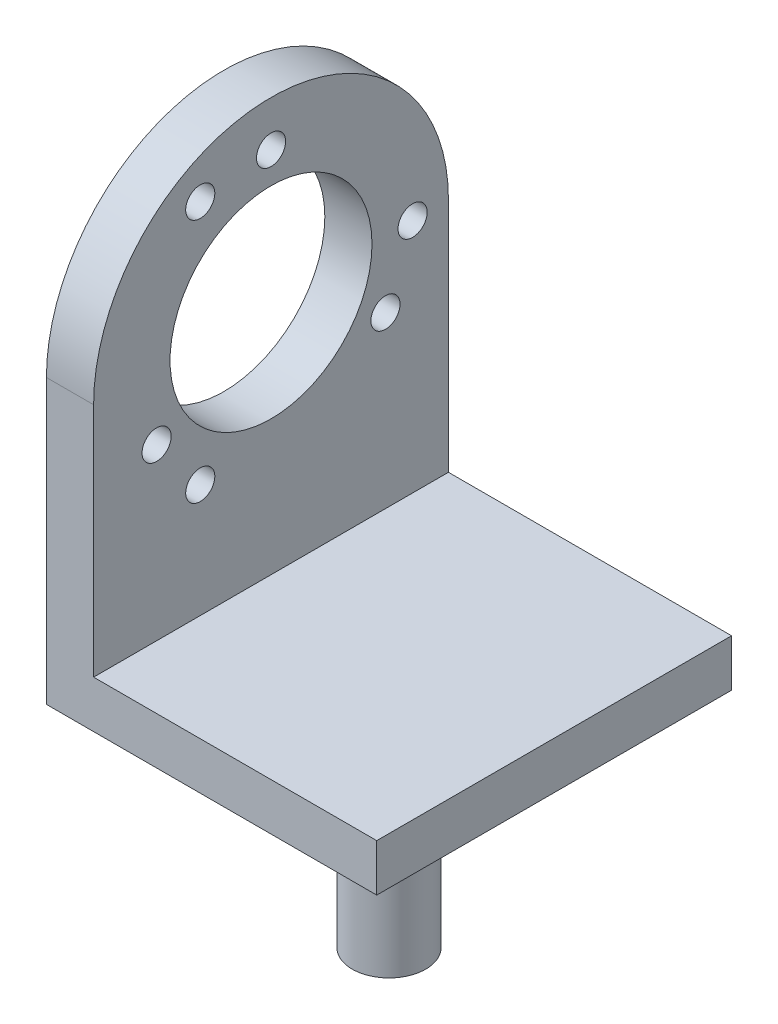
ISO-10303-21;
HEADER;
FILE_DESCRIPTION(('STEP AP214'),'2;1');
FILE_NAME('part.step','',(''),(''),'','','');
FILE_SCHEMA(('AUTOMOTIVE_DESIGN { 1 0 10303 214 1 1 1 1 }'));
ENDSEC;
DATA;
#1=APPLICATION_CONTEXT('core data for automotive mechanical design processes');
#2=APPLICATION_PROTOCOL_DEFINITION('international standard','automotive_design',2000,#1);
#3=PRODUCT_CONTEXT('',#1,'mechanical');
#4=PRODUCT('Part','Part','',(#3));
#5=PRODUCT_RELATED_PRODUCT_CATEGORY('part','',(#4));
#6=PRODUCT_DEFINITION_FORMATION('','',#4);
#7=PRODUCT_DEFINITION_CONTEXT('part definition',#1,'design');
#8=PRODUCT_DEFINITION('design','',#6,#7);
#9=PRODUCT_DEFINITION_SHAPE('','',#8);
#10=(LENGTH_UNIT() NAMED_UNIT(*) SI_UNIT(.MILLI.,.METRE.));
#11=(NAMED_UNIT(*) PLANE_ANGLE_UNIT() SI_UNIT($,.RADIAN.));
#12=(NAMED_UNIT(*) SI_UNIT($,.STERADIAN.) SOLID_ANGLE_UNIT());
#13=UNCERTAINTY_MEASURE_WITH_UNIT(LENGTH_MEASURE(1.E-05),#10,'distance_accuracy_value','');
#14=(GEOMETRIC_REPRESENTATION_CONTEXT(3) GLOBAL_UNCERTAINTY_ASSIGNED_CONTEXT((#13)) GLOBAL_UNIT_ASSIGNED_CONTEXT((#10,
#11,#12)) REPRESENTATION_CONTEXT('',''));
#15=CARTESIAN_POINT('',(0.,0.,0.));
#16=DIRECTION('',(0.,0.,1.));
#17=DIRECTION('',(1.,0.,0.));
#18=AXIS2_PLACEMENT_3D('',#15,#16,#17);
#19=CARTESIAN_POINT('',(-17.5,0.,0.));
#20=DIRECTION('',(0.,-1.,0.));
#21=DIRECTION('',(1.,0.,0.));
#22=AXIS2_PLACEMENT_3D('',#19,#20,#21);
#23=CYLINDRICAL_SURFACE('',#22,9.);
#24=CARTESIAN_POINT('',(-17.5,-8.,0.));
#25=DIRECTION('',(0.,-1.,0.));
#26=DIRECTION('',(1.,0.,0.));
#27=AXIS2_PLACEMENT_3D('',#24,#25,#26);
#28=CIRCLE('',#27,9.);
#29=CARTESIAN_POINT('',(-26.5,-8.,0.));
#30=VERTEX_POINT('',#29);
#31=EDGE_CURVE('E255',#30,#30,#28,.T.);
#32=ORIENTED_EDGE('',*,*,#31,.F.);
#33=DIRECTION('',(0.,1.,0.));
#34=VECTOR('',#33,1.);
#35=CARTESIAN_POINT('',(-26.5,0.,0.));
#36=LINE('',#35,#34);
#37=CARTESIAN_POINT('',(-26.5,0.,0.));
#38=VERTEX_POINT('',#37);
#39=EDGE_CURVE('E10',#30,#38,#36,.T.);
#40=ORIENTED_EDGE('',*,*,#39,.T.);
#41=CARTESIAN_POINT('',(-17.5,0.,0.));
#42=DIRECTION('',(0.,1.,0.));
#43=DIRECTION('',(1.,0.,0.));
#44=AXIS2_PLACEMENT_3D('',#41,#42,#43);
#45=CIRCLE('',#44,9.);
#46=EDGE_CURVE('E267',#38,#38,#45,.T.);
#47=ORIENTED_EDGE('',*,*,#46,.F.);
#48=ORIENTED_EDGE('',*,*,#39,.F.);
#49=EDGE_LOOP('',(#32,#40,#47,#48));
#50=FACE_BOUND('',#49,.T.);
#51=ADVANCED_FACE('F16',(#50),#23,.T.);
#52=CARTESIAN_POINT('',(-35.,23.,12.1243556529822));
#53=DIRECTION('',(1.,0.,0.));
#54=DIRECTION('',(0.,0.,1.));
#55=AXIS2_PLACEMENT_3D('',#52,#53,#54);
#56=CYLINDRICAL_SURFACE('',#55,1.543);
#57=CARTESIAN_POINT('',(-35.,23.,12.1243556529822));
#58=DIRECTION('',(1.,0.,0.));
#59=DIRECTION('',(0.,0.,1.));
#60=AXIS2_PLACEMENT_3D('',#57,#58,#59);
#61=CIRCLE('',#60,1.543);
#62=CARTESIAN_POINT('',(-35.,23.,10.5813556529822));
#63=VERTEX_POINT('',#62);
#64=EDGE_CURVE('E218',#63,#63,#61,.T.);
#65=ORIENTED_EDGE('',*,*,#64,.F.);
#66=DIRECTION('',(1.,0.,0.));
#67=VECTOR('',#66,1.);
#68=CARTESIAN_POINT('',(-35.,23.,10.5813556529822));
#69=LINE('',#68,#67);
#70=CARTESIAN_POINT('',(-30.,23.,10.5813556529822));
#71=VERTEX_POINT('',#70);
#72=EDGE_CURVE('E27',#63,#71,#69,.T.);
#73=ORIENTED_EDGE('',*,*,#72,.T.);
#74=CARTESIAN_POINT('',(-30.,23.,12.1243556529822));
#75=DIRECTION('',(-1.,0.,0.));
#76=DIRECTION('',(0.,0.,1.));
#77=AXIS2_PLACEMENT_3D('',#74,#75,#76);
#78=CIRCLE('',#77,1.543);
#79=EDGE_CURVE('E200',#71,#71,#78,.T.);
#80=ORIENTED_EDGE('',*,*,#79,.F.);
#81=ORIENTED_EDGE('',*,*,#72,.F.);
#82=EDGE_LOOP('',(#65,#73,#80,#81));
#83=FACE_BOUND('',#82,.T.);
#84=ADVANCED_FACE('F512',(#83),#56,.F.);
#85=CARTESIAN_POINT('',(-35.,44.,0.));
#86=DIRECTION('',(1.,0.,0.));
#87=DIRECTION('',(0.,0.,1.));
#88=AXIS2_PLACEMENT_3D('',#85,#86,#87);
#89=CYLINDRICAL_SURFACE('',#88,1.543);
#90=CARTESIAN_POINT('',(-35.,44.,0.));
#91=DIRECTION('',(1.,0.,0.));
#92=DIRECTION('',(0.,0.,1.));
#93=AXIS2_PLACEMENT_3D('',#90,#91,#92);
#94=CIRCLE('',#93,1.543);
#95=CARTESIAN_POINT('',(-35.,44.,-1.543));
#96=VERTEX_POINT('',#95);
#97=EDGE_CURVE('E234',#96,#96,#94,.T.);
#98=ORIENTED_EDGE('',*,*,#97,.F.);
#99=DIRECTION('',(1.,0.,0.));
#100=VECTOR('',#99,1.);
#101=CARTESIAN_POINT('',(-35.,44.,-1.543));
#102=LINE('',#101,#100);
#103=CARTESIAN_POINT('',(-30.,44.,-1.543));
#104=VERTEX_POINT('',#103);
#105=EDGE_CURVE('E228',#96,#104,#102,.T.);
#106=ORIENTED_EDGE('',*,*,#105,.T.);
#107=CARTESIAN_POINT('',(-30.,44.,0.));
#108=DIRECTION('',(-1.,0.,0.));
#109=DIRECTION('',(0.,0.,1.));
#110=AXIS2_PLACEMENT_3D('',#107,#108,#109);
#111=CIRCLE('',#110,1.543);
#112=EDGE_CURVE('E204',#104,#104,#111,.T.);
#113=ORIENTED_EDGE('',*,*,#112,.F.);
#114=ORIENTED_EDGE('',*,*,#105,.F.);
#115=EDGE_LOOP('',(#98,#106,#113,#114));
#116=FACE_BOUND('',#115,.T.);
#117=ADVANCED_FACE('F497',(#116),#89,.F.);
#118=CARTESIAN_POINT('',(-35.,23.,-12.1243556529822));
#119=DIRECTION('',(1.,0.,0.));
#120=DIRECTION('',(0.,0.,1.));
#121=AXIS2_PLACEMENT_3D('',#118,#119,#120);
#122=CYLINDRICAL_SURFACE('',#121,1.543);
#123=CARTESIAN_POINT('',(-35.,23.,-12.1243556529822));
#124=DIRECTION('',(1.,0.,0.));
#125=DIRECTION('',(0.,0.,1.));
#126=AXIS2_PLACEMENT_3D('',#123,#124,#125);
#127=CIRCLE('',#126,1.543);
#128=CARTESIAN_POINT('',(-35.,23.,-13.6673556529822));
#129=VERTEX_POINT('',#128);
#130=EDGE_CURVE('E262',#129,#129,#127,.T.);
#131=ORIENTED_EDGE('',*,*,#130,.F.);
#132=DIRECTION('',(1.,0.,0.));
#133=VECTOR('',#132,1.);
#134=CARTESIAN_POINT('',(-35.,23.,-13.6673556529822));
#135=LINE('',#134,#133);
#136=CARTESIAN_POINT('',(-30.,23.,-13.6673556529822));
#137=VERTEX_POINT('',#136);
#138=EDGE_CURVE('E84',#129,#137,#135,.T.);
#139=ORIENTED_EDGE('',*,*,#138,.T.);
#140=CARTESIAN_POINT('',(-30.,23.,-12.1243556529822));
#141=DIRECTION('',(-1.,0.,0.));
#142=DIRECTION('',(0.,0.,1.));
#143=AXIS2_PLACEMENT_3D('',#140,#141,#142);
#144=CIRCLE('',#143,1.543);
#145=EDGE_CURVE('E186',#137,#137,#144,.T.);
#146=ORIENTED_EDGE('',*,*,#145,.F.);
#147=ORIENTED_EDGE('',*,*,#138,.F.);
#148=EDGE_LOOP('',(#131,#139,#146,#147));
#149=FACE_BOUND('',#148,.T.);
#150=ADVANCED_FACE('F520',(#149),#122,.F.);
#151=CARTESIAN_POINT('',(-35.,30.,-15.));
#152=DIRECTION('',(1.,0.,0.));
#153=DIRECTION('',(0.,0.,1.));
#154=AXIS2_PLACEMENT_3D('',#151,#152,#153);
#155=CYLINDRICAL_SURFACE('',#154,1.543);
#156=CARTESIAN_POINT('',(-35.,30.,-15.));
#157=DIRECTION('',(1.,0.,0.));
#158=DIRECTION('',(0.,0.,1.));
#159=AXIS2_PLACEMENT_3D('',#156,#157,#158);
#160=CIRCLE('',#159,1.543);
#161=CARTESIAN_POINT('',(-35.,30.,-16.543));
#162=VERTEX_POINT('',#161);
#163=EDGE_CURVE('E259',#162,#162,#160,.T.);
#164=ORIENTED_EDGE('',*,*,#163,.F.);
#165=DIRECTION('',(1.,0.,0.));
#166=VECTOR('',#165,1.);
#167=CARTESIAN_POINT('',(-35.,30.,-16.543));
#168=LINE('',#167,#166);
#169=CARTESIAN_POINT('',(-30.,30.,-16.543));
#170=VERTEX_POINT('',#169);
#171=EDGE_CURVE('E97',#162,#170,#168,.T.);
#172=ORIENTED_EDGE('',*,*,#171,.T.);
#173=CARTESIAN_POINT('',(-30.,30.,-15.));
#174=DIRECTION('',(-1.,0.,0.));
#175=DIRECTION('',(0.,0.,1.));
#176=AXIS2_PLACEMENT_3D('',#173,#174,#175);
#177=CIRCLE('',#176,1.543);
#178=EDGE_CURVE('E177',#170,#170,#177,.T.);
#179=ORIENTED_EDGE('',*,*,#178,.F.);
#180=ORIENTED_EDGE('',*,*,#171,.F.);
#181=EDGE_LOOP('',(#164,#172,#179,#180));
#182=FACE_BOUND('',#181,.T.);
#183=ADVANCED_FACE('F504',(#182),#155,.F.);
#184=CARTESIAN_POINT('',(-35.,42.9903810567667,7.5));
#185=DIRECTION('',(1.,0.,0.));
#186=DIRECTION('',(0.,0.,1.));
#187=AXIS2_PLACEMENT_3D('',#184,#185,#186);
#188=CYLINDRICAL_SURFACE('',#187,1.543);
#189=CARTESIAN_POINT('',(-35.,42.9903810567667,7.5));
#190=DIRECTION('',(1.,0.,0.));
#191=DIRECTION('',(0.,0.,1.));
#192=AXIS2_PLACEMENT_3D('',#189,#190,#191);
#193=CIRCLE('',#192,1.543);
#194=CARTESIAN_POINT('',(-35.,42.9903810567667,5.957));
#195=VERTEX_POINT('',#194);
#196=EDGE_CURVE('E169',#195,#195,#193,.T.);
#197=ORIENTED_EDGE('',*,*,#196,.F.);
#198=DIRECTION('',(1.,0.,0.));
#199=VECTOR('',#198,1.);
#200=CARTESIAN_POINT('',(-35.,42.9903810567667,5.957));
#201=LINE('',#200,#199);
#202=CARTESIAN_POINT('',(-30.,42.9903810567667,5.957));
#203=VERTEX_POINT('',#202);
#204=EDGE_CURVE('E164',#195,#203,#201,.T.);
#205=ORIENTED_EDGE('',*,*,#204,.T.);
#206=CARTESIAN_POINT('',(-30.,42.9903810567667,7.5));
#207=DIRECTION('',(-1.,0.,0.));
#208=DIRECTION('',(0.,0.,1.));
#209=AXIS2_PLACEMENT_3D('',#206,#207,#208);
#210=CIRCLE('',#209,1.543);
#211=EDGE_CURVE('E167',#203,#203,#210,.T.);
#212=ORIENTED_EDGE('',*,*,#211,.F.);
#213=ORIENTED_EDGE('',*,*,#204,.F.);
#214=EDGE_LOOP('',(#197,#205,#212,#213));
#215=FACE_BOUND('',#214,.T.);
#216=ADVANCED_FACE('F166',(#215),#188,.F.);
#217=CARTESIAN_POINT('',(-35.,17.0096189432333,7.5));
#218=DIRECTION('',(1.,0.,0.));
#219=DIRECTION('',(0.,0.,1.));
#220=AXIS2_PLACEMENT_3D('',#217,#218,#219);
#221=CYLINDRICAL_SURFACE('',#220,1.543);
#222=CARTESIAN_POINT('',(-35.,17.0096189432333,7.5));
#223=DIRECTION('',(1.,0.,0.));
#224=DIRECTION('',(0.,0.,1.));
#225=AXIS2_PLACEMENT_3D('',#222,#223,#224);
#226=CIRCLE('',#225,1.543);
#227=CARTESIAN_POINT('',(-35.,17.0096189432333,5.957));
#228=VERTEX_POINT('',#227);
#229=EDGE_CURVE('E213',#228,#228,#226,.T.);
#230=ORIENTED_EDGE('',*,*,#229,.F.);
#231=DIRECTION('',(1.,0.,0.));
#232=VECTOR('',#231,1.);
#233=CARTESIAN_POINT('',(-35.,17.0096189432333,5.957));
#234=LINE('',#233,#232);
#235=CARTESIAN_POINT('',(-30.,17.0096189432333,5.957));
#236=VERTEX_POINT('',#235);
#237=EDGE_CURVE('E171',#228,#236,#234,.T.);
#238=ORIENTED_EDGE('',*,*,#237,.T.);
#239=CARTESIAN_POINT('',(-30.,17.0096189432333,7.5));
#240=DIRECTION('',(-1.,0.,0.));
#241=DIRECTION('',(0.,0.,1.));
#242=AXIS2_PLACEMENT_3D('',#239,#240,#241);
#243=CIRCLE('',#242,1.543);
#244=EDGE_CURVE('E178',#236,#236,#243,.T.);
#245=ORIENTED_EDGE('',*,*,#244,.F.);
#246=ORIENTED_EDGE('',*,*,#237,.F.);
#247=EDGE_LOOP('',(#230,#238,#245,#246));
#248=FACE_BOUND('',#247,.T.);
#249=ADVANCED_FACE('F525',(#248),#221,.F.);
#250=CARTESIAN_POINT('',(-35.,30.,0.));
#251=DIRECTION('',(1.,0.,0.));
#252=DIRECTION('',(0.,0.,1.));
#253=AXIS2_PLACEMENT_3D('',#250,#251,#252);
#254=CYLINDRICAL_SURFACE('',#253,10.7);
#255=CARTESIAN_POINT('',(-35.,30.,0.));
#256=DIRECTION('',(1.,0.,0.));
#257=DIRECTION('',(0.,0.,1.));
#258=AXIS2_PLACEMENT_3D('',#255,#256,#257);
#259=CIRCLE('',#258,10.7);
#260=CARTESIAN_POINT('',(-35.,30.,-10.7));
#261=VERTEX_POINT('',#260);
#262=EDGE_CURVE('E209',#261,#261,#259,.T.);
#263=ORIENTED_EDGE('',*,*,#262,.F.);
#264=DIRECTION('',(1.,0.,0.));
#265=VECTOR('',#264,1.);
#266=CARTESIAN_POINT('',(-35.,30.,-10.7));
#267=LINE('',#266,#265);
#268=CARTESIAN_POINT('',(-30.,30.,-10.7));
#269=VERTEX_POINT('',#268);
#270=EDGE_CURVE('E225',#261,#269,#267,.T.);
#271=ORIENTED_EDGE('',*,*,#270,.T.);
#272=CARTESIAN_POINT('',(-30.,30.,0.));
#273=DIRECTION('',(-1.,0.,0.));
#274=DIRECTION('',(0.,0.,1.));
#275=AXIS2_PLACEMENT_3D('',#272,#273,#274);
#276=CIRCLE('',#275,10.7);
#277=EDGE_CURVE('E189',#269,#269,#276,.T.);
#278=ORIENTED_EDGE('',*,*,#277,.F.);
#279=ORIENTED_EDGE('',*,*,#270,.F.);
#280=EDGE_LOOP('',(#263,#271,#278,#279));
#281=FACE_BOUND('',#280,.T.);
#282=ADVANCED_FACE('F528',(#281),#254,.F.);
#283=CARTESIAN_POINT('',(-17.5,24.4,18.8));
#284=DIRECTION('',(0.,0.,1.));
#285=DIRECTION('',(1.,0.,0.));
#286=AXIS2_PLACEMENT_3D('',#283,#284,#285);
#287=PLANE('',#286);
#288=DIRECTION('',(-1.,0.,0.));
#289=VECTOR('',#288,1.);
#290=CARTESIAN_POINT('',(-35.,30.,18.8));
#291=LINE('',#290,#289);
#292=CARTESIAN_POINT('',(-30.,30.,18.8));
#293=VERTEX_POINT('',#292);
#294=CARTESIAN_POINT('',(-35.,30.,18.8));
#295=VERTEX_POINT('',#294);
#296=EDGE_CURVE('E244',#293,#295,#291,.T.);
#297=ORIENTED_EDGE('',*,*,#296,.T.);
#298=DIRECTION('',(0.,-1.,0.));
#299=VECTOR('',#298,1.);
#300=CARTESIAN_POINT('',(-35.,48.8,18.8));
#301=LINE('',#300,#299);
#302=CARTESIAN_POINT('',(-35.,0.,18.8));
#303=VERTEX_POINT('',#302);
#304=EDGE_CURVE('E214',#295,#303,#301,.T.);
#305=ORIENTED_EDGE('',*,*,#304,.T.);
#306=DIRECTION('',(1.,0.,0.));
#307=VECTOR('',#306,1.);
#308=CARTESIAN_POINT('',(-35.,0.,18.8));
#309=LINE('',#308,#307);
#310=CARTESIAN_POINT('',(0.,0.,18.8));
#311=VERTEX_POINT('',#310);
#312=EDGE_CURVE('E263',#303,#311,#309,.T.);
#313=ORIENTED_EDGE('',*,*,#312,.T.);
#314=DIRECTION('',(0.,1.,0.));
#315=VECTOR('',#314,1.);
#316=CARTESIAN_POINT('',(0.,0.,18.8));
#317=LINE('',#316,#315);
#318=CARTESIAN_POINT('',(0.,5.,18.8));
#319=VERTEX_POINT('',#318);
#320=EDGE_CURVE('E279',#311,#319,#317,.T.);
#321=ORIENTED_EDGE('',*,*,#320,.T.);
#322=DIRECTION('',(-1.,0.,0.));
#323=VECTOR('',#322,1.);
#324=CARTESIAN_POINT('',(0.,5.,18.8));
#325=LINE('',#324,#323);
#326=CARTESIAN_POINT('',(-30.,5.,18.8));
#327=VERTEX_POINT('',#326);
#328=EDGE_CURVE('E203',#319,#327,#325,.T.);
#329=ORIENTED_EDGE('',*,*,#328,.T.);
#330=DIRECTION('',(0.,1.,0.));
#331=VECTOR('',#330,1.);
#332=CARTESIAN_POINT('',(-30.,5.,18.8));
#333=LINE('',#332,#331);
#334=EDGE_CURVE('E20',#327,#293,#333,.T.);
#335=ORIENTED_EDGE('',*,*,#334,.T.);
#336=EDGE_LOOP('',(#297,#305,#313,#321,#329,#335));
#337=FACE_BOUND('',#336,.T.);
#338=ADVANCED_FACE('F338',(#337),#287,.T.);
#339=CARTESIAN_POINT('',(0.,5.,0.));
#340=DIRECTION('',(0.,1.,0.));
#341=DIRECTION('',(1.,0.,0.));
#342=AXIS2_PLACEMENT_3D('',#339,#340,#341);
#343=PLANE('',#342);
#344=DIRECTION('',(0.,0.,1.));
#345=VECTOR('',#344,1.);
#346=CARTESIAN_POINT('',(-30.,5.,0.));
#347=LINE('',#346,#345);
#348=CARTESIAN_POINT('',(-30.,5.,-18.8));
#349=VERTEX_POINT('',#348);
#350=EDGE_CURVE('E272',#349,#327,#347,.T.);
#351=ORIENTED_EDGE('',*,*,#350,.T.);
#352=ORIENTED_EDGE('',*,*,#328,.F.);
#353=DIRECTION('',(0.,0.,-1.));
#354=VECTOR('',#353,1.);
#355=CARTESIAN_POINT('',(0.,5.,0.));
#356=LINE('',#355,#354);
#357=CARTESIAN_POINT('',(0.,5.,-18.8));
#358=VERTEX_POINT('',#357);
#359=EDGE_CURVE('E276',#319,#358,#356,.T.);
#360=ORIENTED_EDGE('',*,*,#359,.T.);
#361=DIRECTION('',(1.,0.,0.));
#362=VECTOR('',#361,1.);
#363=CARTESIAN_POINT('',(0.,5.,-18.8));
#364=LINE('',#363,#362);
#365=EDGE_CURVE('E195',#349,#358,#364,.T.);
#366=ORIENTED_EDGE('',*,*,#365,.F.);
#367=EDGE_LOOP('',(#351,#352,#360,#366));
#368=FACE_BOUND('',#367,.T.);
#369=ADVANCED_FACE('F359',(#368),#343,.T.);
#370=CARTESIAN_POINT('',(-30.,5.,0.));
#371=DIRECTION('',(1.,0.,0.));
#372=DIRECTION('',(0.,1.,0.));
#373=AXIS2_PLACEMENT_3D('',#370,#371,#372);
#374=PLANE('',#373);
#375=ORIENTED_EDGE('',*,*,#79,.T.);
#376=EDGE_LOOP('',(#375));
#377=FACE_BOUND('',#376,.T.);
#378=ORIENTED_EDGE('',*,*,#112,.T.);
#379=EDGE_LOOP('',(#378));
#380=FACE_BOUND('',#379,.T.);
#381=ORIENTED_EDGE('',*,*,#145,.T.);
#382=EDGE_LOOP('',(#381));
#383=FACE_BOUND('',#382,.T.);
#384=ORIENTED_EDGE('',*,*,#178,.T.);
#385=EDGE_LOOP('',(#384));
#386=FACE_BOUND('',#385,.T.);
#387=ORIENTED_EDGE('',*,*,#211,.T.);
#388=EDGE_LOOP('',(#387));
#389=FACE_BOUND('',#388,.T.);
#390=ORIENTED_EDGE('',*,*,#244,.T.);
#391=EDGE_LOOP('',(#390));
#392=FACE_BOUND('',#391,.T.);
#393=ORIENTED_EDGE('',*,*,#277,.T.);
#394=EDGE_LOOP('',(#393));
#395=FACE_BOUND('',#394,.T.);
#396=CARTESIAN_POINT('',(-30.,30.,0.));
#397=DIRECTION('',(1.,0.,0.));
#398=DIRECTION('',(0.,0.,-1.));
#399=AXIS2_PLACEMENT_3D('',#396,#397,#398);
#400=CIRCLE('',#399,18.8);
#401=CARTESIAN_POINT('',(-30.,30.,-18.8));
#402=VERTEX_POINT('',#401);
#403=EDGE_CURVE('E250',#402,#293,#400,.T.);
#404=ORIENTED_EDGE('',*,*,#403,.T.);
#405=ORIENTED_EDGE('',*,*,#334,.F.);
#406=ORIENTED_EDGE('',*,*,#350,.F.);
#407=DIRECTION('',(0.,-1.,0.));
#408=VECTOR('',#407,1.);
#409=CARTESIAN_POINT('',(-30.,5.,-18.8));
#410=LINE('',#409,#408);
#411=EDGE_CURVE('E193',#402,#349,#410,.T.);
#412=ORIENTED_EDGE('',*,*,#411,.F.);
#413=EDGE_LOOP('',(#404,#405,#406,#412));
#414=FACE_BOUND('',#413,.T.);
#415=ADVANCED_FACE('F174',(#377,#380,#383,#386,#389,#392,#395,#414),#374,.T.);
#416=CARTESIAN_POINT('',(-35.,0.,0.));
#417=DIRECTION('',(0.,-1.,0.));
#418=DIRECTION('',(0.,0.,-1.));
#419=AXIS2_PLACEMENT_3D('',#416,#417,#418);
#420=PLANE('',#419);
#421=ORIENTED_EDGE('',*,*,#46,.T.);
#422=EDGE_LOOP('',(#421));
#423=FACE_BOUND('',#422,.T.);
#424=DIRECTION('',(0.,0.,1.));
#425=VECTOR('',#424,1.);
#426=CARTESIAN_POINT('',(0.,0.,0.));
#427=LINE('',#426,#425);
#428=CARTESIAN_POINT('',(0.,0.,-18.8));
#429=VERTEX_POINT('',#428);
#430=EDGE_CURVE('E268',#429,#311,#427,.T.);
#431=ORIENTED_EDGE('',*,*,#430,.T.);
#432=ORIENTED_EDGE('',*,*,#312,.F.);
#433=DIRECTION('',(0.,0.,1.));
#434=VECTOR('',#433,1.);
#435=CARTESIAN_POINT('',(-35.,0.,0.));
#436=LINE('',#435,#434);
#437=CARTESIAN_POINT('',(-35.,0.,-18.8));
#438=VERTEX_POINT('',#437);
#439=EDGE_CURVE('E219',#438,#303,#436,.T.);
#440=ORIENTED_EDGE('',*,*,#439,.F.);
#441=DIRECTION('',(-1.,0.,0.));
#442=VECTOR('',#441,1.);
#443=CARTESIAN_POINT('',(-35.,0.,-18.8));
#444=LINE('',#443,#442);
#445=EDGE_CURVE('E208',#429,#438,#444,.T.);
#446=ORIENTED_EDGE('',*,*,#445,.F.);
#447=EDGE_LOOP('',(#431,#432,#440,#446));
#448=FACE_BOUND('',#447,.T.);
#449=ADVANCED_FACE('F337',(#423,#448),#420,.T.);
#450=CARTESIAN_POINT('',(0.,0.,0.));
#451=DIRECTION('',(1.,0.,0.));
#452=DIRECTION('',(0.,1.,0.));
#453=AXIS2_PLACEMENT_3D('',#450,#451,#452);
#454=PLANE('',#453);
#455=ORIENTED_EDGE('',*,*,#359,.F.);
#456=ORIENTED_EDGE('',*,*,#320,.F.);
#457=ORIENTED_EDGE('',*,*,#430,.F.);
#458=DIRECTION('',(0.,-1.,0.));
#459=VECTOR('',#458,1.);
#460=CARTESIAN_POINT('',(0.,0.,-18.8));
#461=LINE('',#460,#459);
#462=EDGE_CURVE('E199',#358,#429,#461,.T.);
#463=ORIENTED_EDGE('',*,*,#462,.F.);
#464=EDGE_LOOP('',(#455,#456,#457,#463));
#465=FACE_BOUND('',#464,.T.);
#466=ADVANCED_FACE('F354',(#465),#454,.T.);
#467=CARTESIAN_POINT('',(-17.5,24.4,-18.8));
#468=DIRECTION('',(0.,0.,-1.));
#469=DIRECTION('',(0.,-1.,0.));
#470=AXIS2_PLACEMENT_3D('',#467,#468,#469);
#471=PLANE('',#470);
#472=DIRECTION('',(-1.,0.,0.));
#473=VECTOR('',#472,1.);
#474=CARTESIAN_POINT('',(-35.,30.,-18.8));
#475=LINE('',#474,#473);
#476=CARTESIAN_POINT('',(-35.,30.,-18.8));
#477=VERTEX_POINT('',#476);
#478=EDGE_CURVE('E254',#402,#477,#475,.T.);
#479=ORIENTED_EDGE('',*,*,#478,.F.);
#480=ORIENTED_EDGE('',*,*,#411,.T.);
#481=ORIENTED_EDGE('',*,*,#365,.T.);
#482=ORIENTED_EDGE('',*,*,#462,.T.);
#483=ORIENTED_EDGE('',*,*,#445,.T.);
#484=DIRECTION('',(0.,1.,0.));
#485=VECTOR('',#484,1.);
#486=CARTESIAN_POINT('',(-35.,48.8,-18.8));
#487=LINE('',#486,#485);
#488=EDGE_CURVE('E248',#438,#477,#487,.T.);
#489=ORIENTED_EDGE('',*,*,#488,.T.);
#490=EDGE_LOOP('',(#479,#480,#481,#482,#483,#489));
#491=FACE_BOUND('',#490,.T.);
#492=ADVANCED_FACE('F349',(#491),#471,.T.);
#493=CARTESIAN_POINT('',(-35.,48.8,0.));
#494=DIRECTION('',(-1.,0.,0.));
#495=DIRECTION('',(0.,1.,0.));
#496=AXIS2_PLACEMENT_3D('',#493,#494,#495);
#497=PLANE('',#496);
#498=ORIENTED_EDGE('',*,*,#262,.T.);
#499=EDGE_LOOP('',(#498));
#500=FACE_BOUND('',#499,.T.);
#501=ORIENTED_EDGE('',*,*,#229,.T.);
#502=EDGE_LOOP('',(#501));
#503=FACE_BOUND('',#502,.T.);
#504=ORIENTED_EDGE('',*,*,#196,.T.);
#505=EDGE_LOOP('',(#504));
#506=FACE_BOUND('',#505,.T.);
#507=ORIENTED_EDGE('',*,*,#163,.T.);
#508=EDGE_LOOP('',(#507));
#509=FACE_BOUND('',#508,.T.);
#510=ORIENTED_EDGE('',*,*,#130,.T.);
#511=EDGE_LOOP('',(#510));
#512=FACE_BOUND('',#511,.T.);
#513=ORIENTED_EDGE('',*,*,#97,.T.);
#514=EDGE_LOOP('',(#513));
#515=FACE_BOUND('',#514,.T.);
#516=ORIENTED_EDGE('',*,*,#64,.T.);
#517=EDGE_LOOP('',(#516));
#518=FACE_BOUND('',#517,.T.);
#519=CARTESIAN_POINT('',(-35.,30.,0.));
#520=DIRECTION('',(-1.,0.,0.));
#521=DIRECTION('',(0.,0.,-1.));
#522=AXIS2_PLACEMENT_3D('',#519,#520,#521);
#523=CIRCLE('',#522,18.8);
#524=EDGE_CURVE('E249',#295,#477,#523,.T.);
#525=ORIENTED_EDGE('',*,*,#524,.T.);
#526=ORIENTED_EDGE('',*,*,#488,.F.);
#527=ORIENTED_EDGE('',*,*,#439,.T.);
#528=ORIENTED_EDGE('',*,*,#304,.F.);
#529=EDGE_LOOP('',(#525,#526,#527,#528));
#530=FACE_BOUND('',#529,.T.);
#531=ADVANCED_FACE('F336',(#500,#503,#506,#509,#512,#515,#518,#530),#497,.T.);
#532=CARTESIAN_POINT('',(-35.,30.,0.));
#533=DIRECTION('',(1.,0.,0.));
#534=DIRECTION('',(0.,0.,-1.));
#535=AXIS2_PLACEMENT_3D('',#532,#533,#534);
#536=CYLINDRICAL_SURFACE('',#535,18.8);
#537=ORIENTED_EDGE('',*,*,#403,.F.);
#538=ORIENTED_EDGE('',*,*,#478,.T.);
#539=ORIENTED_EDGE('',*,*,#524,.F.);
#540=ORIENTED_EDGE('',*,*,#296,.F.);
#541=EDGE_LOOP('',(#537,#538,#539,#540));
#542=FACE_BOUND('',#541,.T.);
#543=ADVANCED_FACE('F344',(#542),#536,.T.);
#544=CARTESIAN_POINT('',(-17.5,-8.,0.));
#545=DIRECTION('',(0.,-1.,0.));
#546=DIRECTION('',(0.,0.,-1.));
#547=AXIS2_PLACEMENT_3D('',#544,#545,#546);
#548=PLANE('',#547);
#549=CARTESIAN_POINT('',(-17.5,-8.,0.));
#550=DIRECTION('',(0.,1.,0.));
#551=DIRECTION('',(1.,0.,0.));
#552=AXIS2_PLACEMENT_3D('',#549,#550,#551);
#553=CIRCLE('',#552,3.9);
#554=CARTESIAN_POINT('',(-21.4,-8.,0.));
#555=VERTEX_POINT('',#554);
#556=EDGE_CURVE('E239',#555,#555,#553,.T.);
#557=ORIENTED_EDGE('',*,*,#556,.T.);
#558=EDGE_LOOP('',(#557));
#559=FACE_BOUND('',#558,.T.);
#560=ORIENTED_EDGE('',*,*,#31,.T.);
#561=EDGE_LOOP('',(#560));
#562=FACE_BOUND('',#561,.T.);
#563=ADVANCED_FACE('F552',(#559,#562),#548,.T.);
#564=CARTESIAN_POINT('',(-17.5,-23.,0.));
#565=DIRECTION('',(0.,-1.,0.));
#566=DIRECTION('',(0.,0.,-1.));
#567=AXIS2_PLACEMENT_3D('',#564,#565,#566);
#568=PLANE('',#567);
#569=CARTESIAN_POINT('',(-17.5,-23.,0.));
#570=DIRECTION('',(0.,-1.,0.));
#571=DIRECTION('',(1.,0.,0.));
#572=AXIS2_PLACEMENT_3D('',#569,#570,#571);
#573=CIRCLE('',#572,3.9);
#574=CARTESIAN_POINT('',(-21.4,-23.,0.));
#575=VERTEX_POINT('',#574);
#576=EDGE_CURVE('E240',#575,#575,#573,.T.);
#577=ORIENTED_EDGE('',*,*,#576,.T.);
#578=EDGE_LOOP('',(#577));
#579=FACE_BOUND('',#578,.T.);
#580=ADVANCED_FACE('F18',(#579),#568,.T.);
#581=CARTESIAN_POINT('',(-17.5,-8.,0.));
#582=DIRECTION('',(0.,-1.,0.));
#583=DIRECTION('',(1.,0.,0.));
#584=AXIS2_PLACEMENT_3D('',#581,#582,#583);
#585=CYLINDRICAL_SURFACE('',#584,3.9);
#586=ORIENTED_EDGE('',*,*,#576,.F.);
#587=DIRECTION('',(0.,1.,0.));
#588=VECTOR('',#587,1.);
#589=CARTESIAN_POINT('',(-21.4,-8.,0.));
#590=LINE('',#589,#588);
#591=EDGE_CURVE('E235',#575,#555,#590,.T.);
#592=ORIENTED_EDGE('',*,*,#591,.T.);
#593=ORIENTED_EDGE('',*,*,#556,.F.);
#594=ORIENTED_EDGE('',*,*,#591,.F.);
#595=EDGE_LOOP('',(#586,#592,#593,#594));
#596=FACE_BOUND('',#595,.T.);
#597=ADVANCED_FACE('F558',(#596),#585,.T.);
#598=CLOSED_SHELL('',(#51,#84,#117,#150,#183,#216,#249,#282,#338,#369,#415,#449,#466,#492,#531,
#543,#563,#580,#597));
#599=MANIFOLD_SOLID_BREP('B1',#598);
#600=ADVANCED_BREP_SHAPE_REPRESENTATION('',(#18,#599),#14);
#601=SHAPE_DEFINITION_REPRESENTATION(#9,#600);
ENDSEC;
END-ISO-10303-21;
